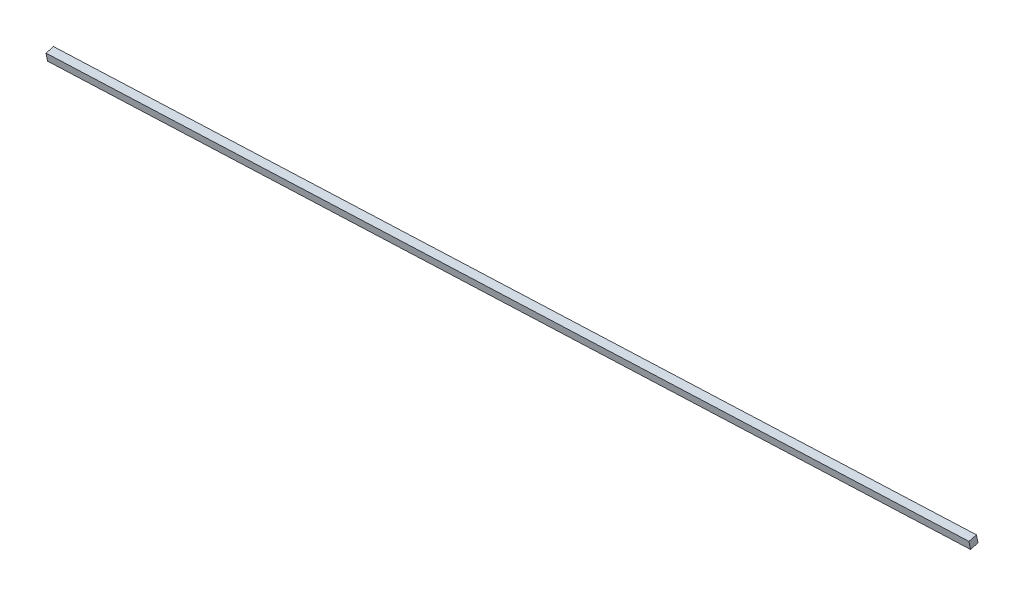
ISO-10303-21;
HEADER;
FILE_DESCRIPTION(('STEP AP214'),'2;1');
FILE_NAME('part.step','',(''),(''),'','','');
FILE_SCHEMA(('AUTOMOTIVE_DESIGN { 1 0 10303 214 1 1 1 1 }'));
ENDSEC;
DATA;
#1=APPLICATION_CONTEXT('core data for automotive mechanical design processes');
#2=APPLICATION_PROTOCOL_DEFINITION('international standard','automotive_design',2000,#1);
#3=PRODUCT_CONTEXT('',#1,'mechanical');
#4=PRODUCT('Part','Part','',(#3));
#5=PRODUCT_RELATED_PRODUCT_CATEGORY('part','',(#4));
#6=PRODUCT_DEFINITION_FORMATION('','',#4);
#7=PRODUCT_DEFINITION_CONTEXT('part definition',#1,'design');
#8=PRODUCT_DEFINITION('design','',#6,#7);
#9=PRODUCT_DEFINITION_SHAPE('','',#8);
#10=(LENGTH_UNIT() NAMED_UNIT(*) SI_UNIT(.MILLI.,.METRE.));
#11=(NAMED_UNIT(*) PLANE_ANGLE_UNIT() SI_UNIT($,.RADIAN.));
#12=(NAMED_UNIT(*) SI_UNIT($,.STERADIAN.) SOLID_ANGLE_UNIT());
#13=UNCERTAINTY_MEASURE_WITH_UNIT(LENGTH_MEASURE(1.E-05),#10,'distance_accuracy_value','');
#14=(GEOMETRIC_REPRESENTATION_CONTEXT(3) GLOBAL_UNCERTAINTY_ASSIGNED_CONTEXT((#13)) GLOBAL_UNIT_ASSIGNED_CONTEXT((#10,
#11,#12)) REPRESENTATION_CONTEXT('',''));
#15=CARTESIAN_POINT('',(0.,0.,0.));
#16=DIRECTION('',(0.,0.,1.));
#17=DIRECTION('',(1.,0.,0.));
#18=AXIS2_PLACEMENT_3D('',#15,#16,#17);
#19=CARTESIAN_POINT('',(-376.342833158039,27.7420590155301,23.628102409236));
#20=DIRECTION('',(0.00889433471955925,0.978990089820875,0.203713757126049));
#21=DIRECTION('',(0.,-0.203721815419336,0.979028815675131));
#22=AXIS2_PLACEMENT_3D('',#19,#20,#21);
#23=PLANE('',#22);
#24=DIRECTION('',(0.999048221581858,0.,-0.0436193873653368));
#25=VECTOR('',#24,1.);
#26=CARTESIAN_POINT('',(-376.342833158039,27.7420590155301,23.628102409236));
#27=LINE('',#26,#25);
#28=CARTESIAN_POINT('',(-371.328998910863,27.7420590155301,23.4091936784173));
#29=VERTEX_POINT('',#28);
#30=CARTESIAN_POINT('',(-39.1226424007336,27.7420590155301,8.90475091298348));
#31=VERTEX_POINT('',#30);
#32=EDGE_CURVE('E95',#29,#31,#27,.T.);
#33=ORIENTED_EDGE('',*,*,#32,.F.);
#34=DIRECTION('',(0.0427029479547232,-0.203907832200028,0.978058308181809));
#35=VECTOR('',#34,1.);
#36=CARTESIAN_POINT('',(-371.328998910863,27.7420590155301,23.4091936784173));
#37=LINE('',#36,#35);
#38=CARTESIAN_POINT('',(-371.200890066999,27.13033551893,26.3433686029627));
#39=VERTEX_POINT('',#38);
#40=EDGE_CURVE('E118',#29,#39,#37,.T.);
#41=ORIENTED_EDGE('',*,*,#40,.T.);
#42=DIRECTION('',(0.999048221581858,0.,-0.0436193873653368));
#43=VECTOR('',#42,1.);
#44=CARTESIAN_POINT('',(-376.214724314175,27.13033551893,26.5622773337814));
#45=LINE('',#44,#43);
#46=CARTESIAN_POINT('',(-38.9945335568694,27.13033551893,11.8389258375289));
#47=VERTEX_POINT('',#46);
#48=EDGE_CURVE('E44',#39,#47,#45,.T.);
#49=ORIENTED_EDGE('',*,*,#48,.T.);
#50=DIRECTION('',(0.0427029479547226,-0.203907832200027,0.978058308181809));
#51=VECTOR('',#50,1.);
#52=CARTESIAN_POINT('',(-39.1226424007336,27.7420590155301,8.90475091298348));
#53=LINE('',#52,#51);
#54=EDGE_CURVE('E107',#31,#47,#53,.T.);
#55=ORIENTED_EDGE('',*,*,#54,.F.);
#56=EDGE_LOOP('',(#33,#41,#49,#55));
#57=FACE_BOUND('',#56,.T.);
#58=ADVANCED_FACE('F40',(#57),#23,.T.);
#59=CARTESIAN_POINT('',(-376.369516162198,24.8050887460675,23.0169611378579));
#60=DIRECTION('',(-0.0427029479547226,0.203907832200029,-0.978058308181808));
#61=DIRECTION('',(0.,0.978951294752608,0.204094004081922));
#62=AXIS2_PLACEMENT_3D('',#59,#60,#61);
#63=PLANE('',#62);
#64=DIRECTION('',(0.999048221581858,0.,-0.0436193873653368));
#65=VECTOR('',#64,1.);
#66=CARTESIAN_POINT('',(-376.369516162198,24.8050887460675,23.0169611378579));
#67=LINE('',#66,#65);
#68=CARTESIAN_POINT('',(-371.355681915022,24.8050887460675,22.7980524070391));
#69=VERTEX_POINT('',#68);
#70=CARTESIAN_POINT('',(-39.1493254048922,24.8050887460674,8.29360964160532));
#71=VERTEX_POINT('',#70);
#72=EDGE_CURVE('E88',#69,#71,#67,.T.);
#73=ORIENTED_EDGE('',*,*,#72,.F.);
#74=DIRECTION('',(0.00889433471955929,0.978990089820875,0.203713757126051));
#75=VECTOR('',#74,1.);
#76=CARTESIAN_POINT('',(-371.355681915022,24.8050887460675,22.7980524070391));
#77=LINE('',#76,#75);
#78=EDGE_CURVE('E80',#69,#29,#77,.T.);
#79=ORIENTED_EDGE('',*,*,#78,.T.);
#80=ORIENTED_EDGE('',*,*,#32,.T.);
#81=DIRECTION('',(0.00889433471955765,0.978990089820875,0.203713757126051));
#82=VECTOR('',#81,1.);
#83=CARTESIAN_POINT('',(-39.1493254048922,24.8050887460674,8.29360964160532));
#84=LINE('',#83,#82);
#85=EDGE_CURVE('E101',#71,#31,#84,.T.);
#86=ORIENTED_EDGE('',*,*,#85,.F.);
#87=EDGE_LOOP('',(#73,#79,#80,#86));
#88=FACE_BOUND('',#87,.T.);
#89=ADVANCED_FACE('F105',(#88),#63,.T.);
#90=CARTESIAN_POINT('',(-376.369516162198,24.8050887460675,23.0169611378579));
#91=DIRECTION('',(0.00889433471955934,0.978990089820875,0.203713757126051));
#92=DIRECTION('',(0.,-0.203721815419338,0.979028815675131));
#93=AXIS2_PLACEMENT_3D('',#90,#91,#92);
#94=PLANE('',#93);
#95=DIRECTION('',(0.0427029479547232,-0.20390783220003,0.978058308181808));
#96=VECTOR('',#95,1.);
#97=CARTESIAN_POINT('',(-371.355681915022,24.8050887460675,22.7980524070391));
#98=LINE('',#97,#96);
#99=CARTESIAN_POINT('',(-371.227573071157,24.1933652494674,25.7322273315846));
#100=VERTEX_POINT('',#99);
#101=EDGE_CURVE('E50',#69,#100,#98,.T.);
#102=ORIENTED_EDGE('',*,*,#101,.F.);
#103=ORIENTED_EDGE('',*,*,#72,.T.);
#104=DIRECTION('',(0.0427029479547226,-0.20390783220003,0.978058308181808));
#105=VECTOR('',#104,1.);
#106=CARTESIAN_POINT('',(-39.1493254048922,24.8050887460674,8.29360964160532));
#107=LINE('',#106,#105);
#108=CARTESIAN_POINT('',(-39.0212165610281,24.1933652494673,11.2277845661507));
#109=VERTEX_POINT('',#108);
#110=EDGE_CURVE('E91',#71,#109,#107,.T.);
#111=ORIENTED_EDGE('',*,*,#110,.T.);
#112=DIRECTION('',(0.999048221581858,0.,-0.0436193873653368));
#113=VECTOR('',#112,1.);
#114=CARTESIAN_POINT('',(-376.241407318334,24.1933652494674,25.9511360624033));
#115=LINE('',#114,#113);
#116=EDGE_CURVE('E63',#100,#109,#115,.T.);
#117=ORIENTED_EDGE('',*,*,#116,.F.);
#118=EDGE_LOOP('',(#102,#103,#111,#117));
#119=FACE_BOUND('',#118,.T.);
#120=ADVANCED_FACE('F90',(#119),#94,.F.);
#121=CARTESIAN_POINT('',(-376.241407318334,24.1933652494674,25.9511360624033));
#122=DIRECTION('',(-0.0427029479547226,0.203907832200029,-0.978058308181808));
#123=DIRECTION('',(0.,0.978951294752608,0.204094004081922));
#124=AXIS2_PLACEMENT_3D('',#121,#122,#123);
#125=PLANE('',#124);
#126=DIRECTION('',(0.00889433471955927,0.978990089820875,0.20371375712605));
#127=VECTOR('',#126,1.);
#128=CARTESIAN_POINT('',(-371.227573071157,24.1933652494674,25.7322273315846));
#129=LINE('',#128,#127);
#130=EDGE_CURVE('E11',#100,#39,#129,.T.);
#131=ORIENTED_EDGE('',*,*,#130,.F.);
#132=ORIENTED_EDGE('',*,*,#116,.T.);
#133=DIRECTION('',(0.00889433471955763,0.978990089820875,0.203713757126051));
#134=VECTOR('',#133,1.);
#135=CARTESIAN_POINT('',(-39.0212165610281,24.1933652494673,11.2277845661507));
#136=LINE('',#135,#134);
#137=EDGE_CURVE('E102',#109,#47,#136,.T.);
#138=ORIENTED_EDGE('',*,*,#137,.T.);
#139=ORIENTED_EDGE('',*,*,#48,.F.);
#140=EDGE_LOOP('',(#131,#132,#138,#139));
#141=FACE_BOUND('',#140,.T.);
#142=ADVANCED_FACE('F126',(#141),#125,.F.);
#143=CARTESIAN_POINT('',(-39.4362557577438,0.,1.72182411116435));
#144=DIRECTION('',(-0.999048221581858,0.,0.0436193873653365));
#145=DIRECTION('',(0.0436193873653365,0.,0.999048221581858));
#146=AXIS2_PLACEMENT_3D('',#143,#144,#145);
#147=PLANE('',#146);
#148=ORIENTED_EDGE('',*,*,#54,.T.);
#149=ORIENTED_EDGE('',*,*,#137,.F.);
#150=ORIENTED_EDGE('',*,*,#110,.F.);
#151=ORIENTED_EDGE('',*,*,#85,.T.);
#152=EDGE_LOOP('',(#148,#149,#150,#151));
#153=FACE_BOUND('',#152,.T.);
#154=ADVANCED_FACE('F100',(#153),#147,.F.);
#155=CARTESIAN_POINT('',(-371.642612267873,0.,16.2262668765984));
#156=DIRECTION('',(-0.999048221581858,0.,0.0436193873653374));
#157=DIRECTION('',(0.0436193873653374,0.,0.999048221581858));
#158=AXIS2_PLACEMENT_3D('',#155,#156,#157);
#159=PLANE('',#158);
#160=ORIENTED_EDGE('',*,*,#40,.F.);
#161=ORIENTED_EDGE('',*,*,#78,.F.);
#162=ORIENTED_EDGE('',*,*,#101,.T.);
#163=ORIENTED_EDGE('',*,*,#130,.T.);
#164=EDGE_LOOP('',(#160,#161,#162,#163));
#165=FACE_BOUND('',#164,.T.);
#166=ADVANCED_FACE('F42',(#165),#159,.T.);
#167=CLOSED_SHELL('',(#58,#89,#120,#142,#154,#166));
#168=MANIFOLD_SOLID_BREP('B2',#167);
#169=ADVANCED_BREP_SHAPE_REPRESENTATION('',(#18,#168),#14);
#170=SHAPE_DEFINITION_REPRESENTATION(#9,#169);
ENDSEC;
END-ISO-10303-21;
